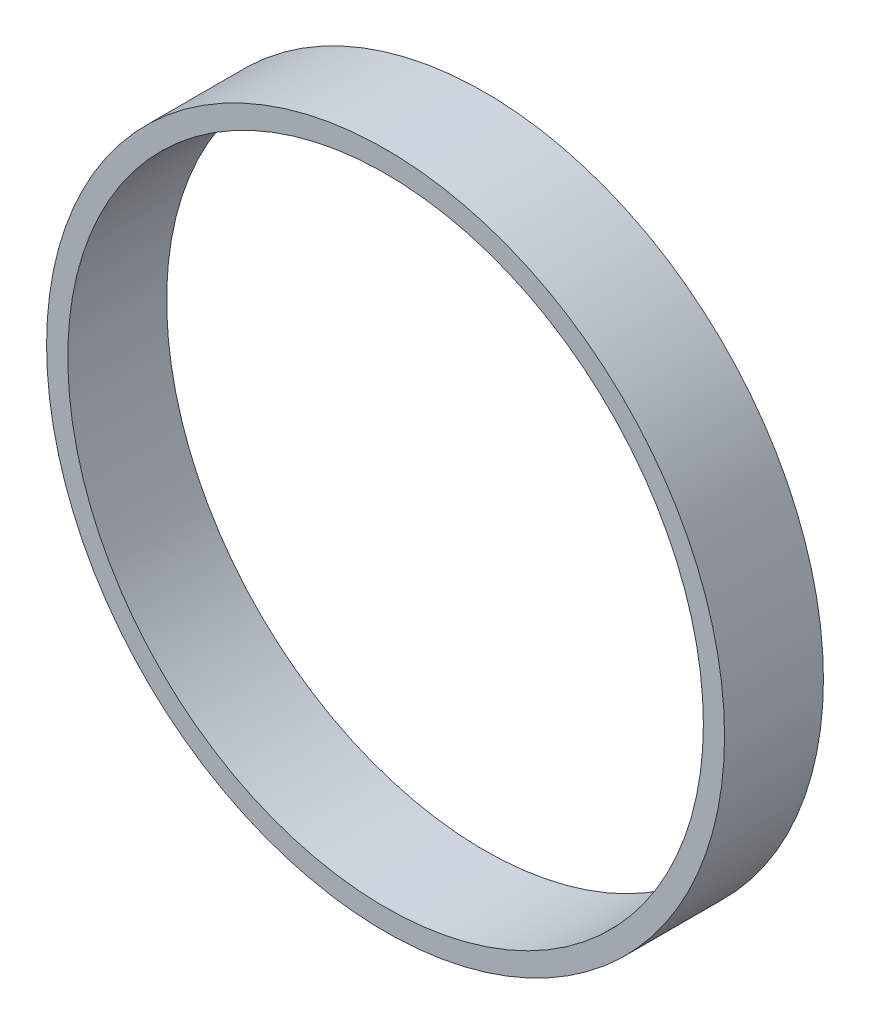
ISO-10303-21;
HEADER;
FILE_DESCRIPTION(('STEP AP214'),'2;1');
FILE_NAME('part.step','',(''),(''),'','','');
FILE_SCHEMA(('AUTOMOTIVE_DESIGN { 1 0 10303 214 1 1 1 1 }'));
ENDSEC;
DATA;
#1=APPLICATION_CONTEXT('core data for automotive mechanical design processes');
#2=APPLICATION_PROTOCOL_DEFINITION('international standard','automotive_design',2000,#1);
#3=PRODUCT_CONTEXT('',#1,'mechanical');
#4=PRODUCT('Part','Part','',(#3));
#5=PRODUCT_RELATED_PRODUCT_CATEGORY('part','',(#4));
#6=PRODUCT_DEFINITION_FORMATION('','',#4);
#7=PRODUCT_DEFINITION_CONTEXT('part definition',#1,'design');
#8=PRODUCT_DEFINITION('design','',#6,#7);
#9=PRODUCT_DEFINITION_SHAPE('','',#8);
#10=(LENGTH_UNIT() NAMED_UNIT(*) SI_UNIT(.MILLI.,.METRE.));
#11=(NAMED_UNIT(*) PLANE_ANGLE_UNIT() SI_UNIT($,.RADIAN.));
#12=(NAMED_UNIT(*) SI_UNIT($,.STERADIAN.) SOLID_ANGLE_UNIT());
#13=UNCERTAINTY_MEASURE_WITH_UNIT(LENGTH_MEASURE(1.E-05),#10,'distance_accuracy_value','');
#14=(GEOMETRIC_REPRESENTATION_CONTEXT(3) GLOBAL_UNCERTAINTY_ASSIGNED_CONTEXT((#13)) GLOBAL_UNIT_ASSIGNED_CONTEXT((#10,
#11,#12)) REPRESENTATION_CONTEXT('',''));
#15=CARTESIAN_POINT('',(0.,0.,0.));
#16=DIRECTION('',(0.,0.,1.));
#17=DIRECTION('',(1.,0.,0.));
#18=AXIS2_PLACEMENT_3D('',#15,#16,#17);
#19=CARTESIAN_POINT('',(0.,0.,7.));
#20=DIRECTION('',(0.,0.,-1.));
#21=DIRECTION('',(-1.,0.,0.));
#22=AXIS2_PLACEMENT_3D('',#19,#20,#21);
#23=CYLINDRICAL_SURFACE('',#22,24.);
#24=CARTESIAN_POINT('',(0.,0.,7.));
#25=DIRECTION('',(0.,0.,1.));
#26=DIRECTION('',(1.,0.,0.));
#27=AXIS2_PLACEMENT_3D('',#24,#25,#26);
#28=CIRCLE('',#27,24.);
#29=CARTESIAN_POINT('',(24.,0.,7.));
#30=VERTEX_POINT('',#29);
#31=EDGE_CURVE('E10',#30,#30,#28,.T.);
#32=ORIENTED_EDGE('',*,*,#31,.F.);
#33=EDGE_LOOP('',(#32));
#34=FACE_BOUND('',#33,.T.);
#35=CARTESIAN_POINT('',(0.,0.,0.));
#36=DIRECTION('',(0.,0.,1.));
#37=DIRECTION('',(1.,0.,0.));
#38=AXIS2_PLACEMENT_3D('',#35,#36,#37);
#39=CIRCLE('',#38,24.);
#40=CARTESIAN_POINT('',(24.,0.,0.));
#41=VERTEX_POINT('',#40);
#42=EDGE_CURVE('E42',#41,#41,#39,.T.);
#43=ORIENTED_EDGE('',*,*,#42,.T.);
#44=EDGE_LOOP('',(#43));
#45=FACE_BOUND('',#44,.T.);
#46=ADVANCED_FACE('F39',(#34,#45),#23,.T.);
#47=CARTESIAN_POINT('',(0.,0.,7.));
#48=DIRECTION('',(0.,0.,1.));
#49=DIRECTION('',(1.,0.,0.));
#50=AXIS2_PLACEMENT_3D('',#47,#48,#49);
#51=PLANE('',#50);
#52=CARTESIAN_POINT('',(0.,0.,7.));
#53=DIRECTION('',(0.,0.,1.));
#54=DIRECTION('',(1.,0.,0.));
#55=AXIS2_PLACEMENT_3D('',#52,#53,#54);
#56=CIRCLE('',#55,22.5);
#57=CARTESIAN_POINT('',(22.5,0.,7.));
#58=VERTEX_POINT('',#57);
#59=EDGE_CURVE('E51',#58,#58,#56,.T.);
#60=ORIENTED_EDGE('',*,*,#59,.F.);
#61=EDGE_LOOP('',(#60));
#62=FACE_BOUND('',#61,.T.);
#63=ORIENTED_EDGE('',*,*,#31,.T.);
#64=EDGE_LOOP('',(#63));
#65=FACE_BOUND('',#64,.T.);
#66=ADVANCED_FACE('F66',(#62,#65),#51,.T.);
#67=CARTESIAN_POINT('',(0.,0.,0.));
#68=DIRECTION('',(0.,0.,1.));
#69=DIRECTION('',(1.,0.,0.));
#70=AXIS2_PLACEMENT_3D('',#67,#68,#69);
#71=PLANE('',#70);
#72=CARTESIAN_POINT('',(0.,0.,0.));
#73=DIRECTION('',(0.,0.,1.));
#74=DIRECTION('',(1.,0.,0.));
#75=AXIS2_PLACEMENT_3D('',#72,#73,#74);
#76=CIRCLE('',#75,22.5);
#77=CARTESIAN_POINT('',(22.5,0.,0.));
#78=VERTEX_POINT('',#77);
#79=EDGE_CURVE('E49',#78,#78,#76,.T.);
#80=ORIENTED_EDGE('',*,*,#79,.T.);
#81=EDGE_LOOP('',(#80));
#82=FACE_BOUND('',#81,.T.);
#83=ORIENTED_EDGE('',*,*,#42,.F.);
#84=EDGE_LOOP('',(#83));
#85=FACE_BOUND('',#84,.T.);
#86=ADVANCED_FACE('F57',(#82,#85),#71,.F.);
#87=CARTESIAN_POINT('',(0.,0.,0.));
#88=DIRECTION('',(0.,0.,1.));
#89=DIRECTION('',(1.,0.,0.));
#90=AXIS2_PLACEMENT_3D('',#87,#88,#89);
#91=CYLINDRICAL_SURFACE('',#90,22.5);
#92=ORIENTED_EDGE('',*,*,#79,.F.);
#93=EDGE_LOOP('',(#92));
#94=FACE_BOUND('',#93,.T.);
#95=ORIENTED_EDGE('',*,*,#59,.T.);
#96=EDGE_LOOP('',(#95));
#97=FACE_BOUND('',#96,.T.);
#98=ADVANCED_FACE('F60',(#94,#97),#91,.F.);
#99=CLOSED_SHELL('',(#46,#66,#86,#98));
#100=MANIFOLD_SOLID_BREP('B2',#99);
#101=ADVANCED_BREP_SHAPE_REPRESENTATION('',(#18,#100),#14);
#102=SHAPE_DEFINITION_REPRESENTATION(#9,#101);
ENDSEC;
END-ISO-10303-21;
